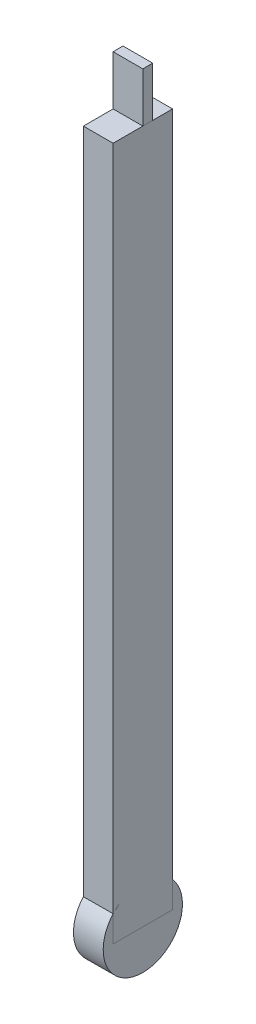
ISO-10303-21;
HEADER;
FILE_DESCRIPTION(('STEP AP214'),'2;1');
FILE_NAME('part.step','',(''),(''),'','','');
FILE_SCHEMA(('AUTOMOTIVE_DESIGN { 1 0 10303 214 1 1 1 1 }'));
ENDSEC;
DATA;
#1=APPLICATION_CONTEXT('core data for automotive mechanical design processes');
#2=APPLICATION_PROTOCOL_DEFINITION('international standard','automotive_design',2000,#1);
#3=PRODUCT_CONTEXT('',#1,'mechanical');
#4=PRODUCT('Part','Part','',(#3));
#5=PRODUCT_RELATED_PRODUCT_CATEGORY('part','',(#4));
#6=PRODUCT_DEFINITION_FORMATION('','',#4);
#7=PRODUCT_DEFINITION_CONTEXT('part definition',#1,'design');
#8=PRODUCT_DEFINITION('design','',#6,#7);
#9=PRODUCT_DEFINITION_SHAPE('','',#8);
#10=(LENGTH_UNIT() NAMED_UNIT(*) SI_UNIT(.MILLI.,.METRE.));
#11=(NAMED_UNIT(*) PLANE_ANGLE_UNIT() SI_UNIT($,.RADIAN.));
#12=(NAMED_UNIT(*) SI_UNIT($,.STERADIAN.) SOLID_ANGLE_UNIT());
#13=UNCERTAINTY_MEASURE_WITH_UNIT(LENGTH_MEASURE(1.E-05),#10,'distance_accuracy_value','');
#14=(GEOMETRIC_REPRESENTATION_CONTEXT(3) GLOBAL_UNCERTAINTY_ASSIGNED_CONTEXT((#13)) GLOBAL_UNIT_ASSIGNED_CONTEXT((#10,
#11,#12)) REPRESENTATION_CONTEXT('',''));
#15=CARTESIAN_POINT('',(0.,0.,0.));
#16=DIRECTION('',(0.,0.,1.));
#17=DIRECTION('',(1.,0.,0.));
#18=AXIS2_PLACEMENT_3D('',#15,#16,#17);
#19=CARTESIAN_POINT('',(0.,-5.,12.));
#20=DIRECTION('',(0.,0.,1.));
#21=DIRECTION('',(1.,0.,0.));
#22=AXIS2_PLACEMENT_3D('',#19,#20,#21);
#23=PLANE('',#22);
#24=DIRECTION('',(-1.,0.,0.));
#25=VECTOR('',#24,1.);
#26=CARTESIAN_POINT('',(0.,-75.,12.));
#27=LINE('',#26,#25);
#28=CARTESIAN_POINT('',(3.,-75.,12.));
#29=VERTEX_POINT('',#28);
#30=CARTESIAN_POINT('',(-3.,-75.,12.));
#31=VERTEX_POINT('',#30);
#32=EDGE_CURVE('P0_E11',#29,#31,#27,.T.);
#33=ORIENTED_EDGE('',*,*,#32,.F.);
#34=DIRECTION('',(0.,-1.,0.));
#35=VECTOR('',#34,1.);
#36=CARTESIAN_POINT('',(3.,-5.,12.));
#37=LINE('',#36,#35);
#38=CARTESIAN_POINT('',(3.,65.,12.));
#39=VERTEX_POINT('',#38);
#40=EDGE_CURVE('P0_E61',#39,#29,#37,.T.);
#41=ORIENTED_EDGE('',*,*,#40,.F.);
#42=DIRECTION('',(1.,0.,0.));
#43=VECTOR('',#42,1.);
#44=CARTESIAN_POINT('',(0.,65.,12.));
#45=LINE('',#44,#43);
#46=CARTESIAN_POINT('',(-3.,65.,12.));
#47=VERTEX_POINT('',#46);
#48=EDGE_CURVE('P0_E87',#47,#39,#45,.T.);
#49=ORIENTED_EDGE('',*,*,#48,.F.);
#50=DIRECTION('',(0.,1.,0.));
#51=VECTOR('',#50,1.);
#52=CARTESIAN_POINT('',(-3.,-5.,12.));
#53=LINE('',#52,#51);
#54=EDGE_CURVE('P0_E24',#31,#47,#53,.T.);
#55=ORIENTED_EDGE('',*,*,#54,.F.);
#56=EDGE_LOOP('',(#33,#41,#49,#55));
#57=FACE_BOUND('',#56,.T.);
#58=ADVANCED_FACE('P0_F17',(#57),#23,.T.);
#59=CARTESIAN_POINT('',(0.,-75.,0.));
#60=DIRECTION('',(0.,-1.,0.));
#61=DIRECTION('',(0.,0.,-1.));
#62=AXIS2_PLACEMENT_3D('',#59,#60,#61);
#63=PLANE('',#62);
#64=DIRECTION('',(0.,0.,1.));
#65=VECTOR('',#64,1.);
#66=CARTESIAN_POINT('',(3.,-75.,0.));
#67=LINE('',#66,#65);
#68=CARTESIAN_POINT('',(3.,-75.,0.));
#69=VERTEX_POINT('',#68);
#70=EDGE_CURVE('P0_E54',#69,#29,#67,.T.);
#71=ORIENTED_EDGE('',*,*,#70,.T.);
#72=ORIENTED_EDGE('',*,*,#32,.T.);
#73=DIRECTION('',(0.,0.,1.));
#74=VECTOR('',#73,1.);
#75=CARTESIAN_POINT('',(-3.,-75.,0.));
#76=LINE('',#75,#74);
#77=CARTESIAN_POINT('',(-3.,-75.,0.));
#78=VERTEX_POINT('',#77);
#79=EDGE_CURVE('P0_E67',#78,#31,#76,.T.);
#80=ORIENTED_EDGE('',*,*,#79,.F.);
#81=DIRECTION('',(1.,0.,0.));
#82=VECTOR('',#81,1.);
#83=CARTESIAN_POINT('',(0.,-75.,0.));
#84=LINE('',#83,#82);
#85=EDGE_CURVE('P0_E65',#78,#69,#84,.T.);
#86=ORIENTED_EDGE('',*,*,#85,.T.);
#87=EDGE_LOOP('',(#71,#72,#80,#86));
#88=FACE_BOUND('',#87,.T.);
#89=ADVANCED_FACE('P0_F66',(#88),#63,.T.);
#90=CARTESIAN_POINT('',(-3.,-5.,0.));
#91=DIRECTION('',(-1.,0.,0.));
#92=DIRECTION('',(0.,0.,1.));
#93=AXIS2_PLACEMENT_3D('',#90,#91,#92);
#94=PLANE('',#93);
#95=ORIENTED_EDGE('',*,*,#79,.T.);
#96=ORIENTED_EDGE('',*,*,#54,.T.);
#97=DIRECTION('',(0.,0.,1.));
#98=VECTOR('',#97,1.);
#99=CARTESIAN_POINT('',(-3.,65.,0.));
#100=LINE('',#99,#98);
#101=CARTESIAN_POINT('',(-3.,65.,0.));
#102=VERTEX_POINT('',#101);
#103=EDGE_CURVE('P0_E82',#102,#47,#100,.T.);
#104=ORIENTED_EDGE('',*,*,#103,.F.);
#105=DIRECTION('',(0.,-1.,0.));
#106=VECTOR('',#105,1.);
#107=CARTESIAN_POINT('',(-3.,-5.,0.));
#108=LINE('',#107,#106);
#109=EDGE_CURVE('P0_E71',#102,#78,#108,.T.);
#110=ORIENTED_EDGE('',*,*,#109,.T.);
#111=EDGE_LOOP('',(#95,#96,#104,#110));
#112=FACE_BOUND('',#111,.T.);
#113=ADVANCED_FACE('P0_F91',(#112),#94,.T.);
#114=CARTESIAN_POINT('',(0.,65.,0.));
#115=DIRECTION('',(0.,1.,0.));
#116=DIRECTION('',(0.,0.,1.));
#117=AXIS2_PLACEMENT_3D('',#114,#115,#116);
#118=PLANE('',#117);
#119=ORIENTED_EDGE('',*,*,#103,.T.);
#120=ORIENTED_EDGE('',*,*,#48,.T.);
#121=DIRECTION('',(0.,0.,1.));
#122=VECTOR('',#121,1.);
#123=CARTESIAN_POINT('',(3.,65.,0.));
#124=LINE('',#123,#122);
#125=CARTESIAN_POINT('',(3.,65.,0.));
#126=VERTEX_POINT('',#125);
#127=EDGE_CURVE('P0_E62',#126,#39,#124,.T.);
#128=ORIENTED_EDGE('',*,*,#127,.F.);
#129=DIRECTION('',(-1.,0.,0.));
#130=VECTOR('',#129,1.);
#131=CARTESIAN_POINT('',(0.,65.,0.));
#132=LINE('',#131,#130);
#133=EDGE_CURVE('P0_E76',#126,#102,#132,.T.);
#134=ORIENTED_EDGE('',*,*,#133,.T.);
#135=EDGE_LOOP('',(#119,#120,#128,#134));
#136=FACE_BOUND('',#135,.T.);
#137=ADVANCED_FACE('P0_F89',(#136),#118,.T.);
#138=CARTESIAN_POINT('',(0.,-5.,0.));
#139=DIRECTION('',(0.,0.,-1.));
#140=DIRECTION('',(-1.,0.,0.));
#141=AXIS2_PLACEMENT_3D('',#138,#139,#140);
#142=PLANE('',#141);
#143=DIRECTION('',(0.,1.,0.));
#144=VECTOR('',#143,1.);
#145=CARTESIAN_POINT('',(3.,-5.,0.));
#146=LINE('',#145,#144);
#147=EDGE_CURVE('P0_E59',#69,#126,#146,.T.);
#148=ORIENTED_EDGE('',*,*,#147,.F.);
#149=ORIENTED_EDGE('',*,*,#85,.F.);
#150=ORIENTED_EDGE('',*,*,#109,.F.);
#151=ORIENTED_EDGE('',*,*,#133,.F.);
#152=EDGE_LOOP('',(#148,#149,#150,#151));
#153=FACE_BOUND('',#152,.T.);
#154=ADVANCED_FACE('P0_F74',(#153),#142,.T.);
#155=CARTESIAN_POINT('',(3.,-5.,0.));
#156=DIRECTION('',(1.,0.,0.));
#157=DIRECTION('',(0.,0.,-1.));
#158=AXIS2_PLACEMENT_3D('',#155,#156,#157);
#159=PLANE('',#158);
#160=ORIENTED_EDGE('',*,*,#147,.T.);
#161=ORIENTED_EDGE('',*,*,#127,.T.);
#162=ORIENTED_EDGE('',*,*,#40,.T.);
#163=ORIENTED_EDGE('',*,*,#70,.F.);
#164=EDGE_LOOP('',(#160,#161,#162,#163));
#165=FACE_BOUND('',#164,.T.);
#166=ADVANCED_FACE('P0_F56',(#165),#159,.T.);
#167=CLOSED_SHELL('',(#58,#89,#113,#137,#154,#166));
#168=MANIFOLD_SOLID_BREP('P0_B1',#167);
#169=CARTESIAN_POINT('',(3.,-75.,6.));
#170=DIRECTION('',(1.,0.,0.));
#171=DIRECTION('',(0.,0.,-1.));
#172=AXIS2_PLACEMENT_3D('',#169,#170,#171);
#173=PLANE('',#172);
#174=CARTESIAN_POINT('',(3.,-75.,6.));
#175=DIRECTION('',(-1.,0.,0.));
#176=DIRECTION('',(0.,0.,1.));
#177=AXIS2_PLACEMENT_3D('',#174,#175,#176);
#178=CIRCLE('',#177,8.);
#179=CARTESIAN_POINT('',(3.,-75.,14.));
#180=VERTEX_POINT('',#179);
#181=EDGE_CURVE('P1_E10',#180,#180,#178,.T.);
#182=ORIENTED_EDGE('',*,*,#181,.F.);
#183=EDGE_LOOP('',(#182));
#184=FACE_BOUND('',#183,.T.);
#185=ADVANCED_FACE('P1_F15',(#184),#173,.T.);
#186=CARTESIAN_POINT('',(-3.,-75.,6.));
#187=DIRECTION('',(-1.,0.,0.));
#188=DIRECTION('',(0.,0.,1.));
#189=AXIS2_PLACEMENT_3D('',#186,#187,#188);
#190=PLANE('',#189);
#191=CARTESIAN_POINT('',(-3.,-75.,6.));
#192=DIRECTION('',(1.,0.,0.));
#193=DIRECTION('',(0.,0.,-1.));
#194=AXIS2_PLACEMENT_3D('',#191,#192,#193);
#195=CIRCLE('',#194,8.);
#196=CARTESIAN_POINT('',(-3.,-75.,-2.));
#197=VERTEX_POINT('',#196);
#198=EDGE_CURVE('P1_E22',#197,#197,#195,.T.);
#199=ORIENTED_EDGE('',*,*,#198,.F.);
#200=EDGE_LOOP('',(#199));
#201=FACE_BOUND('',#200,.T.);
#202=ADVANCED_FACE('P1_F29',(#201),#190,.T.);
#203=CARTESIAN_POINT('',(-3.,-75.,6.));
#204=DIRECTION('',(1.,0.,0.));
#205=DIRECTION('',(0.,0.,-1.));
#206=AXIS2_PLACEMENT_3D('',#203,#204,#205);
#207=CYLINDRICAL_SURFACE('',#206,8.);
#208=ORIENTED_EDGE('',*,*,#181,.T.);
#209=EDGE_LOOP('',(#208));
#210=FACE_BOUND('',#209,.T.);
#211=ORIENTED_EDGE('',*,*,#198,.T.);
#212=EDGE_LOOP('',(#211));
#213=FACE_BOUND('',#212,.T.);
#214=ADVANCED_FACE('P1_F17',(#210,#213),#207,.T.);
#215=CLOSED_SHELL('',(#185,#202,#214));
#216=MANIFOLD_SOLID_BREP('P1_B1',#215);
#217=CARTESIAN_POINT('',(0.,70.,6.));
#218=DIRECTION('',(0.,0.,1.));
#219=DIRECTION('',(1.,0.,0.));
#220=AXIS2_PLACEMENT_3D('',#217,#218,#219);
#221=PLANE('',#220);
#222=DIRECTION('',(-1.,0.,0.));
#223=VECTOR('',#222,1.);
#224=CARTESIAN_POINT('',(0.,65.,6.));
#225=LINE('',#224,#223);
#226=CARTESIAN_POINT('',(3.,65.,6.));
#227=VERTEX_POINT('',#226);
#228=CARTESIAN_POINT('',(-3.,65.,6.));
#229=VERTEX_POINT('',#228);
#230=EDGE_CURVE('P2_E10',#227,#229,#225,.T.);
#231=ORIENTED_EDGE('',*,*,#230,.F.);
#232=DIRECTION('',(0.,-1.,0.));
#233=VECTOR('',#232,1.);
#234=CARTESIAN_POINT('',(3.,70.,6.));
#235=LINE('',#234,#233);
#236=CARTESIAN_POINT('',(3.,75.,6.));
#237=VERTEX_POINT('',#236);
#238=EDGE_CURVE('P2_E60',#237,#227,#235,.T.);
#239=ORIENTED_EDGE('',*,*,#238,.F.);
#240=DIRECTION('',(1.,0.,0.));
#241=VECTOR('',#240,1.);
#242=CARTESIAN_POINT('',(0.,75.,6.));
#243=LINE('',#242,#241);
#244=CARTESIAN_POINT('',(-3.,75.,6.));
#245=VERTEX_POINT('',#244);
#246=EDGE_CURVE('P2_E86',#245,#237,#243,.T.);
#247=ORIENTED_EDGE('',*,*,#246,.F.);
#248=DIRECTION('',(0.,1.,0.));
#249=VECTOR('',#248,1.);
#250=CARTESIAN_POINT('',(-3.,70.,6.));
#251=LINE('',#250,#249);
#252=EDGE_CURVE('P2_E23',#229,#245,#251,.T.);
#253=ORIENTED_EDGE('',*,*,#252,.F.);
#254=EDGE_LOOP('',(#231,#239,#247,#253));
#255=FACE_BOUND('',#254,.T.);
#256=ADVANCED_FACE('P2_F16',(#255),#221,.T.);
#257=CARTESIAN_POINT('',(0.,65.,4.));
#258=DIRECTION('',(0.,-1.,0.));
#259=DIRECTION('',(0.,0.,-1.));
#260=AXIS2_PLACEMENT_3D('',#257,#258,#259);
#261=PLANE('',#260);
#262=DIRECTION('',(0.,0.,1.));
#263=VECTOR('',#262,1.);
#264=CARTESIAN_POINT('',(3.,65.,4.));
#265=LINE('',#264,#263);
#266=CARTESIAN_POINT('',(3.,65.,4.));
#267=VERTEX_POINT('',#266);
#268=EDGE_CURVE('P2_E53',#267,#227,#265,.T.);
#269=ORIENTED_EDGE('',*,*,#268,.T.);
#270=ORIENTED_EDGE('',*,*,#230,.T.);
#271=DIRECTION('',(0.,0.,1.));
#272=VECTOR('',#271,1.);
#273=CARTESIAN_POINT('',(-3.,65.,4.));
#274=LINE('',#273,#272);
#275=CARTESIAN_POINT('',(-3.,65.,4.));
#276=VERTEX_POINT('',#275);
#277=EDGE_CURVE('P2_E66',#276,#229,#274,.T.);
#278=ORIENTED_EDGE('',*,*,#277,.F.);
#279=DIRECTION('',(1.,0.,0.));
#280=VECTOR('',#279,1.);
#281=CARTESIAN_POINT('',(0.,65.,4.));
#282=LINE('',#281,#280);
#283=EDGE_CURVE('P2_E64',#276,#267,#282,.T.);
#284=ORIENTED_EDGE('',*,*,#283,.T.);
#285=EDGE_LOOP('',(#269,#270,#278,#284));
#286=FACE_BOUND('',#285,.T.);
#287=ADVANCED_FACE('P2_F65',(#286),#261,.T.);
#288=CARTESIAN_POINT('',(-3.,70.,4.));
#289=DIRECTION('',(-1.,0.,0.));
#290=DIRECTION('',(0.,0.,1.));
#291=AXIS2_PLACEMENT_3D('',#288,#289,#290);
#292=PLANE('',#291);
#293=ORIENTED_EDGE('',*,*,#277,.T.);
#294=ORIENTED_EDGE('',*,*,#252,.T.);
#295=DIRECTION('',(0.,0.,1.));
#296=VECTOR('',#295,1.);
#297=CARTESIAN_POINT('',(-3.,75.,4.));
#298=LINE('',#297,#296);
#299=CARTESIAN_POINT('',(-3.,75.,4.));
#300=VERTEX_POINT('',#299);
#301=EDGE_CURVE('P2_E81',#300,#245,#298,.T.);
#302=ORIENTED_EDGE('',*,*,#301,.F.);
#303=DIRECTION('',(0.,-1.,0.));
#304=VECTOR('',#303,1.);
#305=CARTESIAN_POINT('',(-3.,70.,4.));
#306=LINE('',#305,#304);
#307=EDGE_CURVE('P2_E70',#300,#276,#306,.T.);
#308=ORIENTED_EDGE('',*,*,#307,.T.);
#309=EDGE_LOOP('',(#293,#294,#302,#308));
#310=FACE_BOUND('',#309,.T.);
#311=ADVANCED_FACE('P2_F90',(#310),#292,.T.);
#312=CARTESIAN_POINT('',(0.,75.,4.));
#313=DIRECTION('',(0.,1.,0.));
#314=DIRECTION('',(0.,0.,1.));
#315=AXIS2_PLACEMENT_3D('',#312,#313,#314);
#316=PLANE('',#315);
#317=ORIENTED_EDGE('',*,*,#301,.T.);
#318=ORIENTED_EDGE('',*,*,#246,.T.);
#319=DIRECTION('',(0.,0.,1.));
#320=VECTOR('',#319,1.);
#321=CARTESIAN_POINT('',(3.,75.,4.));
#322=LINE('',#321,#320);
#323=CARTESIAN_POINT('',(3.,75.,4.));
#324=VERTEX_POINT('',#323);
#325=EDGE_CURVE('P2_E61',#324,#237,#322,.T.);
#326=ORIENTED_EDGE('',*,*,#325,.F.);
#327=DIRECTION('',(-1.,0.,0.));
#328=VECTOR('',#327,1.);
#329=CARTESIAN_POINT('',(0.,75.,4.));
#330=LINE('',#329,#328);
#331=EDGE_CURVE('P2_E75',#324,#300,#330,.T.);
#332=ORIENTED_EDGE('',*,*,#331,.T.);
#333=EDGE_LOOP('',(#317,#318,#326,#332));
#334=FACE_BOUND('',#333,.T.);
#335=ADVANCED_FACE('P2_F88',(#334),#316,.T.);
#336=CARTESIAN_POINT('',(0.,70.,4.));
#337=DIRECTION('',(0.,0.,-1.));
#338=DIRECTION('',(-1.,0.,0.));
#339=AXIS2_PLACEMENT_3D('',#336,#337,#338);
#340=PLANE('',#339);
#341=DIRECTION('',(0.,1.,0.));
#342=VECTOR('',#341,1.);
#343=CARTESIAN_POINT('',(3.,70.,4.));
#344=LINE('',#343,#342);
#345=EDGE_CURVE('P2_E58',#267,#324,#344,.T.);
#346=ORIENTED_EDGE('',*,*,#345,.F.);
#347=ORIENTED_EDGE('',*,*,#283,.F.);
#348=ORIENTED_EDGE('',*,*,#307,.F.);
#349=ORIENTED_EDGE('',*,*,#331,.F.);
#350=EDGE_LOOP('',(#346,#347,#348,#349));
#351=FACE_BOUND('',#350,.T.);
#352=ADVANCED_FACE('P2_F73',(#351),#340,.T.);
#353=CARTESIAN_POINT('',(3.,70.,4.));
#354=DIRECTION('',(1.,0.,0.));
#355=DIRECTION('',(0.,0.,-1.));
#356=AXIS2_PLACEMENT_3D('',#353,#354,#355);
#357=PLANE('',#356);
#358=ORIENTED_EDGE('',*,*,#345,.T.);
#359=ORIENTED_EDGE('',*,*,#325,.T.);
#360=ORIENTED_EDGE('',*,*,#238,.T.);
#361=ORIENTED_EDGE('',*,*,#268,.F.);
#362=EDGE_LOOP('',(#358,#359,#360,#361));
#363=FACE_BOUND('',#362,.T.);
#364=ADVANCED_FACE('P2_F55',(#363),#357,.T.);
#365=CLOSED_SHELL('',(#256,#287,#311,#335,#352,#364));
#366=MANIFOLD_SOLID_BREP('P2_B1',#365);
#367=ADVANCED_BREP_SHAPE_REPRESENTATION('',(#18,#168,#216,#366),#14);
#368=SHAPE_DEFINITION_REPRESENTATION(#9,#367);
ENDSEC;
END-ISO-10303-21;
